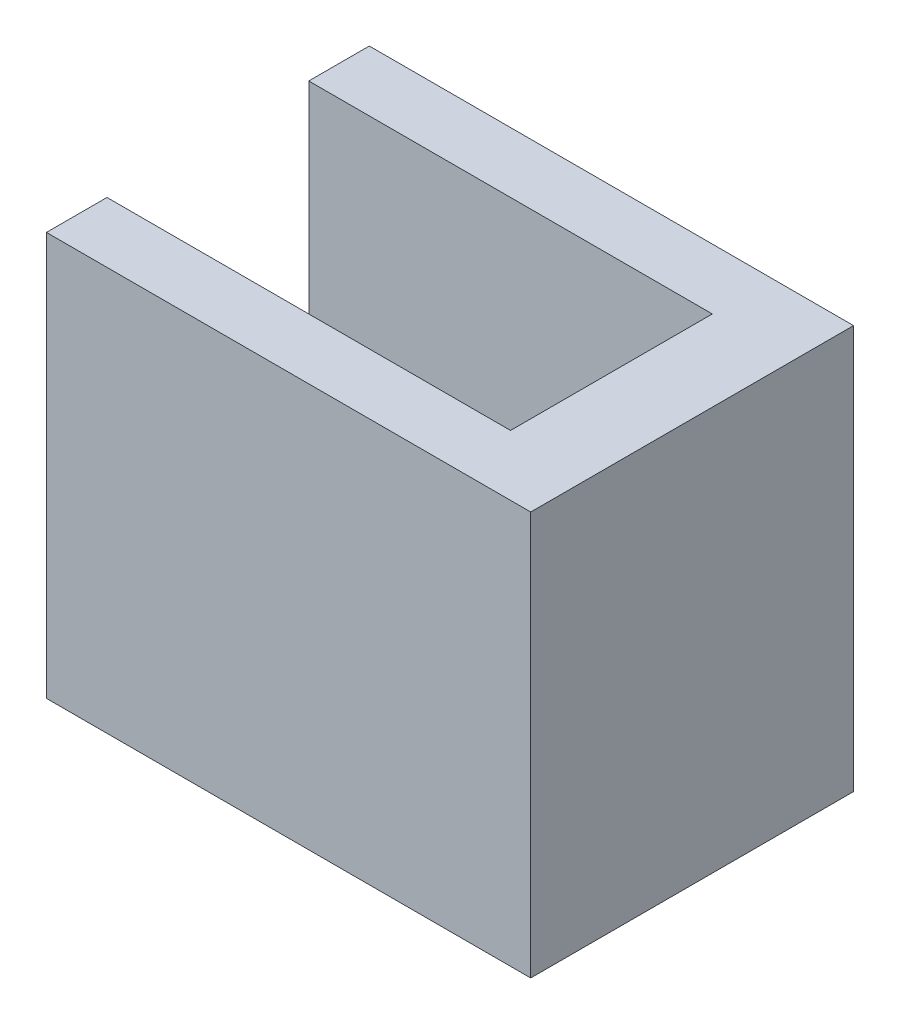
ISO-10303-21;
HEADER;
FILE_DESCRIPTION(('STEP AP214'),'2;1');
FILE_NAME('part.step','',(''),(''),'','','');
FILE_SCHEMA(('AUTOMOTIVE_DESIGN { 1 0 10303 214 1 1 1 1 }'));
ENDSEC;
DATA;
#1=APPLICATION_CONTEXT('core data for automotive mechanical design processes');
#2=APPLICATION_PROTOCOL_DEFINITION('international standard','automotive_design',2000,#1);
#3=PRODUCT_CONTEXT('',#1,'mechanical');
#4=PRODUCT('Part','Part','',(#3));
#5=PRODUCT_RELATED_PRODUCT_CATEGORY('part','',(#4));
#6=PRODUCT_DEFINITION_FORMATION('','',#4);
#7=PRODUCT_DEFINITION_CONTEXT('part definition',#1,'design');
#8=PRODUCT_DEFINITION('design','',#6,#7);
#9=PRODUCT_DEFINITION_SHAPE('','',#8);
#10=(LENGTH_UNIT() NAMED_UNIT(*) SI_UNIT(.MILLI.,.METRE.));
#11=(NAMED_UNIT(*) PLANE_ANGLE_UNIT() SI_UNIT($,.RADIAN.));
#12=(NAMED_UNIT(*) SI_UNIT($,.STERADIAN.) SOLID_ANGLE_UNIT());
#13=UNCERTAINTY_MEASURE_WITH_UNIT(LENGTH_MEASURE(1.E-05),#10,'distance_accuracy_value','');
#14=(GEOMETRIC_REPRESENTATION_CONTEXT(3) GLOBAL_UNCERTAINTY_ASSIGNED_CONTEXT((#13)) GLOBAL_UNIT_ASSIGNED_CONTEXT((#10,
#11,#12)) REPRESENTATION_CONTEXT('',''));
#15=CARTESIAN_POINT('',(0.,0.,0.));
#16=DIRECTION('',(0.,0.,1.));
#17=DIRECTION('',(1.,0.,0.));
#18=AXIS2_PLACEMENT_3D('',#15,#16,#17);
#19=CARTESIAN_POINT('',(-6.73913043478261,10.,-5.34782608695652));
#20=DIRECTION('',(1.,0.,0.));
#21=DIRECTION('',(0.,0.,-1.));
#22=AXIS2_PLACEMENT_3D('',#19,#20,#21);
#23=PLANE('',#22);
#24=DIRECTION('',(0.,0.,1.));
#25=VECTOR('',#24,1.);
#26=CARTESIAN_POINT('',(-6.73913043478261,0.,-5.34782608695652));
#27=LINE('',#26,#25);
#28=CARTESIAN_POINT('',(-6.73913043478261,0.,-5.34782608695652));
#29=VERTEX_POINT('',#28);
#30=CARTESIAN_POINT('',(-6.73913043478261,0.,-3.84782608695652));
#31=VERTEX_POINT('',#30);
#32=EDGE_CURVE('E129',#29,#31,#27,.T.);
#33=ORIENTED_EDGE('',*,*,#32,.T.);
#34=DIRECTION('',(0.,-1.,0.));
#35=VECTOR('',#34,1.);
#36=CARTESIAN_POINT('',(-6.73913043478261,10.,-3.84782608695652));
#37=LINE('',#36,#35);
#38=CARTESIAN_POINT('',(-6.73913043478261,10.,-3.84782608695652));
#39=VERTEX_POINT('',#38);
#40=EDGE_CURVE('E11',#39,#31,#37,.T.);
#41=ORIENTED_EDGE('',*,*,#40,.F.);
#42=DIRECTION('',(0.,0.,1.));
#43=VECTOR('',#42,1.);
#44=CARTESIAN_POINT('',(-6.73913043478261,10.,-5.34782608695652));
#45=LINE('',#44,#43);
#46=CARTESIAN_POINT('',(-6.73913043478261,10.,-5.34782608695652));
#47=VERTEX_POINT('',#46);
#48=EDGE_CURVE('E143',#47,#39,#45,.T.);
#49=ORIENTED_EDGE('',*,*,#48,.F.);
#50=DIRECTION('',(0.,-1.,0.));
#51=VECTOR('',#50,1.);
#52=CARTESIAN_POINT('',(-6.73913043478261,10.,-5.34782608695652));
#53=LINE('',#52,#51);
#54=EDGE_CURVE('E125',#47,#29,#53,.T.);
#55=ORIENTED_EDGE('',*,*,#54,.T.);
#56=EDGE_LOOP('',(#33,#41,#49,#55));
#57=FACE_BOUND('',#56,.T.);
#58=ADVANCED_FACE('F33',(#57),#23,.F.);
#59=CARTESIAN_POINT('',(-6.73913043478261,10.,-3.84782608695652));
#60=DIRECTION('',(0.,0.,-1.));
#61=DIRECTION('',(-1.,0.,0.));
#62=AXIS2_PLACEMENT_3D('',#59,#60,#61);
#63=PLANE('',#62);
#64=DIRECTION('',(1.,0.,0.));
#65=VECTOR('',#64,1.);
#66=CARTESIAN_POINT('',(-6.73913043478261,0.,-3.84782608695652));
#67=LINE('',#66,#65);
#68=CARTESIAN_POINT('',(3.26086956521739,0.,-3.84782608695652));
#69=VERTEX_POINT('',#68);
#70=EDGE_CURVE('E132',#31,#69,#67,.T.);
#71=ORIENTED_EDGE('',*,*,#70,.T.);
#72=DIRECTION('',(0.,-1.,0.));
#73=VECTOR('',#72,1.);
#74=CARTESIAN_POINT('',(3.26086956521739,10.,-3.84782608695652));
#75=LINE('',#74,#73);
#76=CARTESIAN_POINT('',(3.26086956521739,10.,-3.84782608695652));
#77=VERTEX_POINT('',#76);
#78=EDGE_CURVE('E41',#77,#69,#75,.T.);
#79=ORIENTED_EDGE('',*,*,#78,.F.);
#80=DIRECTION('',(1.,0.,0.));
#81=VECTOR('',#80,1.);
#82=CARTESIAN_POINT('',(-6.73913043478261,10.,-3.84782608695652));
#83=LINE('',#82,#81);
#84=EDGE_CURVE('E92',#39,#77,#83,.T.);
#85=ORIENTED_EDGE('',*,*,#84,.F.);
#86=ORIENTED_EDGE('',*,*,#40,.T.);
#87=EDGE_LOOP('',(#71,#79,#85,#86));
#88=FACE_BOUND('',#87,.T.);
#89=ADVANCED_FACE('F178',(#88),#63,.F.);
#90=CARTESIAN_POINT('',(3.26086956521739,10.,-3.84782608695652));
#91=DIRECTION('',(1.,0.,0.));
#92=DIRECTION('',(0.,0.,-1.));
#93=AXIS2_PLACEMENT_3D('',#90,#91,#92);
#94=PLANE('',#93);
#95=DIRECTION('',(0.,0.,1.));
#96=VECTOR('',#95,1.);
#97=CARTESIAN_POINT('',(3.26086956521739,0.,-3.84782608695652));
#98=LINE('',#97,#96);
#99=CARTESIAN_POINT('',(3.26086956521739,0.,1.15217391304348));
#100=VERTEX_POINT('',#99);
#101=EDGE_CURVE('E134',#69,#100,#98,.T.);
#102=ORIENTED_EDGE('',*,*,#101,.T.);
#103=DIRECTION('',(0.,-1.,0.));
#104=VECTOR('',#103,1.);
#105=CARTESIAN_POINT('',(3.26086956521739,10.,1.15217391304348));
#106=LINE('',#105,#104);
#107=CARTESIAN_POINT('',(3.26086956521739,10.,1.15217391304348));
#108=VERTEX_POINT('',#107);
#109=EDGE_CURVE('E150',#108,#100,#106,.T.);
#110=ORIENTED_EDGE('',*,*,#109,.F.);
#111=DIRECTION('',(0.,0.,1.));
#112=VECTOR('',#111,1.);
#113=CARTESIAN_POINT('',(3.26086956521739,10.,-3.84782608695652));
#114=LINE('',#113,#112);
#115=EDGE_CURVE('E158',#77,#108,#114,.T.);
#116=ORIENTED_EDGE('',*,*,#115,.F.);
#117=ORIENTED_EDGE('',*,*,#78,.T.);
#118=EDGE_LOOP('',(#102,#110,#116,#117));
#119=FACE_BOUND('',#118,.T.);
#120=ADVANCED_FACE('F156',(#119),#94,.F.);
#121=CARTESIAN_POINT('',(-6.73913043478261,10.,1.15217391304348));
#122=DIRECTION('',(0.,0.,1.));
#123=DIRECTION('',(1.,0.,0.));
#124=AXIS2_PLACEMENT_3D('',#121,#122,#123);
#125=PLANE('',#124);
#126=DIRECTION('',(-1.,0.,0.));
#127=VECTOR('',#126,1.);
#128=CARTESIAN_POINT('',(-6.73913043478261,0.,1.15217391304348));
#129=LINE('',#128,#127);
#130=CARTESIAN_POINT('',(-6.73913043478261,0.,1.15217391304348));
#131=VERTEX_POINT('',#130);
#132=EDGE_CURVE('E136',#100,#131,#129,.T.);
#133=ORIENTED_EDGE('',*,*,#132,.T.);
#134=DIRECTION('',(0.,-1.,0.));
#135=VECTOR('',#134,1.);
#136=CARTESIAN_POINT('',(-6.73913043478261,10.,1.15217391304348));
#137=LINE('',#136,#135);
#138=CARTESIAN_POINT('',(-6.73913043478261,10.,1.15217391304348));
#139=VERTEX_POINT('',#138);
#140=EDGE_CURVE('E147',#139,#131,#137,.T.);
#141=ORIENTED_EDGE('',*,*,#140,.F.);
#142=DIRECTION('',(-1.,0.,0.));
#143=VECTOR('',#142,1.);
#144=CARTESIAN_POINT('',(-6.73913043478261,10.,1.15217391304348));
#145=LINE('',#144,#143);
#146=EDGE_CURVE('E170',#108,#139,#145,.T.);
#147=ORIENTED_EDGE('',*,*,#146,.F.);
#148=ORIENTED_EDGE('',*,*,#109,.T.);
#149=EDGE_LOOP('',(#133,#141,#147,#148));
#150=FACE_BOUND('',#149,.T.);
#151=ADVANCED_FACE('F166',(#150),#125,.F.);
#152=CARTESIAN_POINT('',(-6.73913043478261,10.,1.15217391304348));
#153=DIRECTION('',(1.,0.,0.));
#154=DIRECTION('',(0.,0.,-1.));
#155=AXIS2_PLACEMENT_3D('',#152,#153,#154);
#156=PLANE('',#155);
#157=DIRECTION('',(0.,0.,1.));
#158=VECTOR('',#157,1.);
#159=CARTESIAN_POINT('',(-6.73913043478261,0.,1.15217391304348));
#160=LINE('',#159,#158);
#161=CARTESIAN_POINT('',(-6.73913043478261,0.,2.65217391304348));
#162=VERTEX_POINT('',#161);
#163=EDGE_CURVE('E138',#131,#162,#160,.T.);
#164=ORIENTED_EDGE('',*,*,#163,.T.);
#165=DIRECTION('',(0.,-1.,0.));
#166=VECTOR('',#165,1.);
#167=CARTESIAN_POINT('',(-6.73913043478261,10.,2.65217391304348));
#168=LINE('',#167,#166);
#169=CARTESIAN_POINT('',(-6.73913043478261,10.,2.65217391304348));
#170=VERTEX_POINT('',#169);
#171=EDGE_CURVE('E120',#170,#162,#168,.T.);
#172=ORIENTED_EDGE('',*,*,#171,.F.);
#173=DIRECTION('',(0.,0.,1.));
#174=VECTOR('',#173,1.);
#175=CARTESIAN_POINT('',(-6.73913043478261,10.,1.15217391304348));
#176=LINE('',#175,#174);
#177=EDGE_CURVE('E111',#139,#170,#176,.T.);
#178=ORIENTED_EDGE('',*,*,#177,.F.);
#179=ORIENTED_EDGE('',*,*,#140,.T.);
#180=EDGE_LOOP('',(#164,#172,#178,#179));
#181=FACE_BOUND('',#180,.T.);
#182=ADVANCED_FACE('F169',(#181),#156,.F.);
#183=CARTESIAN_POINT('',(-6.73913043478261,10.,2.65217391304348));
#184=DIRECTION('',(0.,0.,-1.));
#185=DIRECTION('',(-1.,0.,0.));
#186=AXIS2_PLACEMENT_3D('',#183,#184,#185);
#187=PLANE('',#186);
#188=DIRECTION('',(1.,0.,0.));
#189=VECTOR('',#188,1.);
#190=CARTESIAN_POINT('',(-6.73913043478261,0.,2.65217391304348));
#191=LINE('',#190,#189);
#192=CARTESIAN_POINT('',(5.2608695652174,0.,2.65217391304348));
#193=VERTEX_POINT('',#192);
#194=EDGE_CURVE('E119',#162,#193,#191,.T.);
#195=ORIENTED_EDGE('',*,*,#194,.T.);
#196=DIRECTION('',(0.,-1.,0.));
#197=VECTOR('',#196,1.);
#198=CARTESIAN_POINT('',(5.2608695652174,10.,2.65217391304348));
#199=LINE('',#198,#197);
#200=CARTESIAN_POINT('',(5.2608695652174,10.,2.65217391304348));
#201=VERTEX_POINT('',#200);
#202=EDGE_CURVE('E116',#201,#193,#199,.T.);
#203=ORIENTED_EDGE('',*,*,#202,.F.);
#204=DIRECTION('',(1.,0.,0.));
#205=VECTOR('',#204,1.);
#206=CARTESIAN_POINT('',(-6.73913043478261,10.,2.65217391304348));
#207=LINE('',#206,#205);
#208=EDGE_CURVE('E105',#170,#201,#207,.T.);
#209=ORIENTED_EDGE('',*,*,#208,.F.);
#210=ORIENTED_EDGE('',*,*,#171,.T.);
#211=EDGE_LOOP('',(#195,#203,#209,#210));
#212=FACE_BOUND('',#211,.T.);
#213=ADVANCED_FACE('F117',(#212),#187,.F.);
#214=CARTESIAN_POINT('',(5.2608695652174,10.,-5.34782608695652));
#215=DIRECTION('',(-1.,0.,0.));
#216=DIRECTION('',(0.,0.,1.));
#217=AXIS2_PLACEMENT_3D('',#214,#215,#216);
#218=PLANE('',#217);
#219=DIRECTION('',(0.,0.,-1.));
#220=VECTOR('',#219,1.);
#221=CARTESIAN_POINT('',(5.2608695652174,0.,-5.34782608695652));
#222=LINE('',#221,#220);
#223=CARTESIAN_POINT('',(5.2608695652174,0.,-5.34782608695652));
#224=VERTEX_POINT('',#223);
#225=EDGE_CURVE('E78',#193,#224,#222,.T.);
#226=ORIENTED_EDGE('',*,*,#225,.T.);
#227=DIRECTION('',(0.,-1.,0.));
#228=VECTOR('',#227,1.);
#229=CARTESIAN_POINT('',(5.2608695652174,10.,-5.34782608695652));
#230=LINE('',#229,#228);
#231=CARTESIAN_POINT('',(5.2608695652174,10.,-5.34782608695652));
#232=VERTEX_POINT('',#231);
#233=EDGE_CURVE('E121',#232,#224,#230,.T.);
#234=ORIENTED_EDGE('',*,*,#233,.F.);
#235=DIRECTION('',(0.,0.,-1.));
#236=VECTOR('',#235,1.);
#237=CARTESIAN_POINT('',(5.2608695652174,10.,-5.34782608695652));
#238=LINE('',#237,#236);
#239=EDGE_CURVE('E109',#201,#232,#238,.T.);
#240=ORIENTED_EDGE('',*,*,#239,.F.);
#241=ORIENTED_EDGE('',*,*,#202,.T.);
#242=EDGE_LOOP('',(#226,#234,#240,#241));
#243=FACE_BOUND('',#242,.T.);
#244=ADVANCED_FACE('F123',(#243),#218,.F.);
#245=CARTESIAN_POINT('',(-6.73913043478261,10.,-5.34782608695652));
#246=DIRECTION('',(0.,0.,1.));
#247=DIRECTION('',(1.,0.,0.));
#248=AXIS2_PLACEMENT_3D('',#245,#246,#247);
#249=PLANE('',#248);
#250=DIRECTION('',(-1.,0.,0.));
#251=VECTOR('',#250,1.);
#252=CARTESIAN_POINT('',(-6.73913043478261,0.,-5.34782608695652));
#253=LINE('',#252,#251);
#254=EDGE_CURVE('E84',#224,#29,#253,.T.);
#255=ORIENTED_EDGE('',*,*,#254,.T.);
#256=ORIENTED_EDGE('',*,*,#54,.F.);
#257=DIRECTION('',(-1.,0.,0.));
#258=VECTOR('',#257,1.);
#259=CARTESIAN_POINT('',(-6.73913043478261,10.,-5.34782608695652));
#260=LINE('',#259,#258);
#261=EDGE_CURVE('E49',#232,#47,#260,.T.);
#262=ORIENTED_EDGE('',*,*,#261,.F.);
#263=ORIENTED_EDGE('',*,*,#233,.T.);
#264=EDGE_LOOP('',(#255,#256,#262,#263));
#265=FACE_BOUND('',#264,.T.);
#266=ADVANCED_FACE('F194',(#265),#249,.F.);
#267=CARTESIAN_POINT('',(0.,10.,0.));
#268=DIRECTION('',(0.,1.,0.));
#269=DIRECTION('',(0.,0.,1.));
#270=AXIS2_PLACEMENT_3D('',#267,#268,#269);
#271=PLANE('',#270);
#272=ORIENTED_EDGE('',*,*,#48,.T.);
#273=ORIENTED_EDGE('',*,*,#84,.T.);
#274=ORIENTED_EDGE('',*,*,#115,.T.);
#275=ORIENTED_EDGE('',*,*,#146,.T.);
#276=ORIENTED_EDGE('',*,*,#177,.T.);
#277=ORIENTED_EDGE('',*,*,#208,.T.);
#278=ORIENTED_EDGE('',*,*,#239,.T.);
#279=ORIENTED_EDGE('',*,*,#261,.T.);
#280=EDGE_LOOP('',(#272,#273,#274,#275,#276,#277,#278,#279));
#281=FACE_BOUND('',#280,.T.);
#282=ADVANCED_FACE('F107',(#281),#271,.T.);
#283=CARTESIAN_POINT('',(0.,0.,0.));
#284=DIRECTION('',(0.,1.,0.));
#285=DIRECTION('',(0.,0.,1.));
#286=AXIS2_PLACEMENT_3D('',#283,#284,#285);
#287=PLANE('',#286);
#288=ORIENTED_EDGE('',*,*,#32,.F.);
#289=ORIENTED_EDGE('',*,*,#254,.F.);
#290=ORIENTED_EDGE('',*,*,#225,.F.);
#291=ORIENTED_EDGE('',*,*,#194,.F.);
#292=ORIENTED_EDGE('',*,*,#163,.F.);
#293=ORIENTED_EDGE('',*,*,#132,.F.);
#294=ORIENTED_EDGE('',*,*,#101,.F.);
#295=ORIENTED_EDGE('',*,*,#70,.F.);
#296=EDGE_LOOP('',(#288,#289,#290,#291,#292,#293,#294,#295));
#297=FACE_BOUND('',#296,.T.);
#298=ADVANCED_FACE('F162',(#297),#287,.F.);
#299=CLOSED_SHELL('',(#58,#89,#120,#151,#182,#213,#244,#266,#282,#298));
#300=MANIFOLD_SOLID_BREP('B2',#299);
#301=ADVANCED_BREP_SHAPE_REPRESENTATION('',(#18,#300),#14);
#302=SHAPE_DEFINITION_REPRESENTATION(#9,#301);
ENDSEC;
END-ISO-10303-21;
